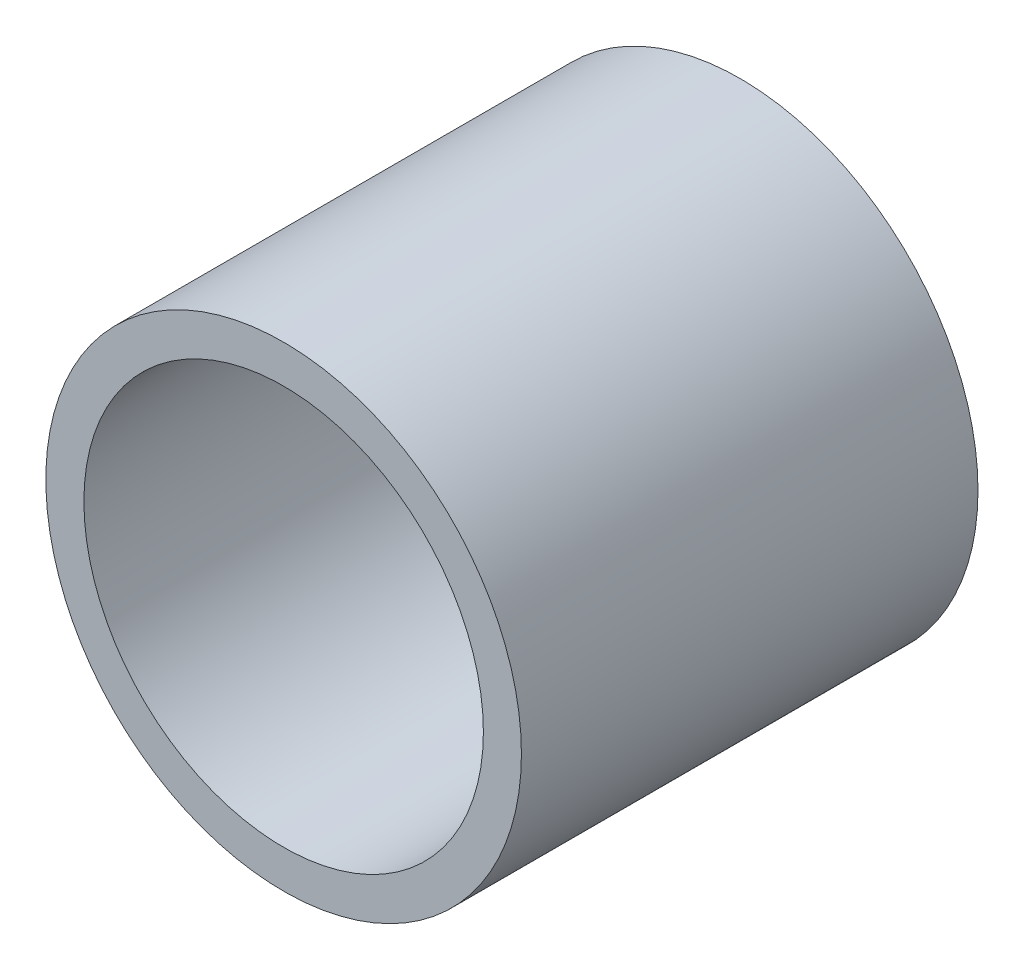
ISO-10303-21;
HEADER;
FILE_DESCRIPTION(('STEP AP214'),'2;1');
FILE_NAME('part.step','',(''),(''),'','','');
FILE_SCHEMA(('AUTOMOTIVE_DESIGN { 1 0 10303 214 1 1 1 1 }'));
ENDSEC;
DATA;
#1=APPLICATION_CONTEXT('core data for automotive mechanical design processes');
#2=APPLICATION_PROTOCOL_DEFINITION('international standard','automotive_design',2000,#1);
#3=PRODUCT_CONTEXT('',#1,'mechanical');
#4=PRODUCT('Part','Part','',(#3));
#5=PRODUCT_RELATED_PRODUCT_CATEGORY('part','',(#4));
#6=PRODUCT_DEFINITION_FORMATION('','',#4);
#7=PRODUCT_DEFINITION_CONTEXT('part definition',#1,'design');
#8=PRODUCT_DEFINITION('design','',#6,#7);
#9=PRODUCT_DEFINITION_SHAPE('','',#8);
#10=(LENGTH_UNIT() NAMED_UNIT(*) SI_UNIT(.MILLI.,.METRE.));
#11=(NAMED_UNIT(*) PLANE_ANGLE_UNIT() SI_UNIT($,.RADIAN.));
#12=(NAMED_UNIT(*) SI_UNIT($,.STERADIAN.) SOLID_ANGLE_UNIT());
#13=UNCERTAINTY_MEASURE_WITH_UNIT(LENGTH_MEASURE(1.E-05),#10,'distance_accuracy_value','');
#14=(GEOMETRIC_REPRESENTATION_CONTEXT(3) GLOBAL_UNCERTAINTY_ASSIGNED_CONTEXT((#13)) GLOBAL_UNIT_ASSIGNED_CONTEXT((#10,
#11,#12)) REPRESENTATION_CONTEXT('',''));
#15=CARTESIAN_POINT('',(0.,0.,0.));
#16=DIRECTION('',(0.,0.,1.));
#17=DIRECTION('',(1.,0.,0.));
#18=AXIS2_PLACEMENT_3D('',#15,#16,#17);
#19=CARTESIAN_POINT('',(0.,0.,2.4));
#20=DIRECTION('',(0.,0.,-1.));
#21=DIRECTION('',(-1.,0.,0.));
#22=AXIS2_PLACEMENT_3D('',#19,#20,#21);
#23=CYLINDRICAL_SURFACE('',#22,1.25);
#24=CARTESIAN_POINT('',(0.,0.,2.4));
#25=DIRECTION('',(0.,0.,1.));
#26=DIRECTION('',(1.,0.,0.));
#27=AXIS2_PLACEMENT_3D('',#24,#25,#26);
#28=CIRCLE('',#27,1.25);
#29=CARTESIAN_POINT('',(1.25,0.,2.4));
#30=VERTEX_POINT('',#29);
#31=EDGE_CURVE('E10',#30,#30,#28,.T.);
#32=ORIENTED_EDGE('',*,*,#31,.F.);
#33=EDGE_LOOP('',(#32));
#34=FACE_BOUND('',#33,.T.);
#35=CARTESIAN_POINT('',(0.,0.,0.));
#36=DIRECTION('',(0.,0.,1.));
#37=DIRECTION('',(1.,0.,0.));
#38=AXIS2_PLACEMENT_3D('',#35,#36,#37);
#39=CIRCLE('',#38,1.25);
#40=CARTESIAN_POINT('',(1.25,0.,0.));
#41=VERTEX_POINT('',#40);
#42=EDGE_CURVE('E41',#41,#41,#39,.T.);
#43=ORIENTED_EDGE('',*,*,#42,.T.);
#44=EDGE_LOOP('',(#43));
#45=FACE_BOUND('',#44,.T.);
#46=ADVANCED_FACE('F38',(#34,#45),#23,.T.);
#47=CARTESIAN_POINT('',(0.,0.,2.4));
#48=DIRECTION('',(0.,0.,1.));
#49=DIRECTION('',(1.,0.,0.));
#50=AXIS2_PLACEMENT_3D('',#47,#48,#49);
#51=PLANE('',#50);
#52=CARTESIAN_POINT('',(0.,0.,2.4));
#53=DIRECTION('',(0.,0.,1.));
#54=DIRECTION('',(1.,0.,0.));
#55=AXIS2_PLACEMENT_3D('',#52,#53,#54);
#56=CIRCLE('',#55,1.05);
#57=CARTESIAN_POINT('',(1.05,0.,2.4));
#58=VERTEX_POINT('',#57);
#59=EDGE_CURVE('E50',#58,#58,#56,.T.);
#60=ORIENTED_EDGE('',*,*,#59,.F.);
#61=EDGE_LOOP('',(#60));
#62=FACE_BOUND('',#61,.T.);
#63=ORIENTED_EDGE('',*,*,#31,.T.);
#64=EDGE_LOOP('',(#63));
#65=FACE_BOUND('',#64,.T.);
#66=ADVANCED_FACE('F65',(#62,#65),#51,.T.);
#67=CARTESIAN_POINT('',(0.,0.,0.));
#68=DIRECTION('',(0.,0.,1.));
#69=DIRECTION('',(1.,0.,0.));
#70=AXIS2_PLACEMENT_3D('',#67,#68,#69);
#71=PLANE('',#70);
#72=ORIENTED_EDGE('',*,*,#42,.F.);
#73=EDGE_LOOP('',(#72));
#74=FACE_BOUND('',#73,.T.);
#75=ADVANCED_FACE('F61',(#74),#71,.F.);
#76=CARTESIAN_POINT('',(0.,0.,0.4));
#77=DIRECTION('',(0.,0.,1.));
#78=DIRECTION('',(1.,0.,0.));
#79=AXIS2_PLACEMENT_3D('',#76,#77,#78);
#80=CYLINDRICAL_SURFACE('',#79,1.05);
#81=CARTESIAN_POINT('',(0.,0.,0.4));
#82=DIRECTION('',(0.,0.,1.));
#83=DIRECTION('',(1.,0.,0.));
#84=AXIS2_PLACEMENT_3D('',#81,#82,#83);
#85=CIRCLE('',#84,1.05);
#86=CARTESIAN_POINT('',(1.05,0.,0.4));
#87=VERTEX_POINT('',#86);
#88=EDGE_CURVE('E48',#87,#87,#85,.T.);
#89=ORIENTED_EDGE('',*,*,#88,.F.);
#90=EDGE_LOOP('',(#89));
#91=FACE_BOUND('',#90,.T.);
#92=ORIENTED_EDGE('',*,*,#59,.T.);
#93=EDGE_LOOP('',(#92));
#94=FACE_BOUND('',#93,.T.);
#95=ADVANCED_FACE('F58',(#91,#94),#80,.F.);
#96=CARTESIAN_POINT('',(0.,0.,0.4));
#97=DIRECTION('',(0.,0.,1.));
#98=DIRECTION('',(1.,0.,0.));
#99=AXIS2_PLACEMENT_3D('',#96,#97,#98);
#100=PLANE('',#99);
#101=ORIENTED_EDGE('',*,*,#88,.T.);
#102=EDGE_LOOP('',(#101));
#103=FACE_BOUND('',#102,.T.);
#104=ADVANCED_FACE('F56',(#103),#100,.T.);
#105=CLOSED_SHELL('',(#46,#66,#75,#95,#104));
#106=MANIFOLD_SOLID_BREP('B2',#105);
#107=ADVANCED_BREP_SHAPE_REPRESENTATION('',(#18,#106),#14);
#108=SHAPE_DEFINITION_REPRESENTATION(#9,#107);
ENDSEC;
END-ISO-10303-21;
